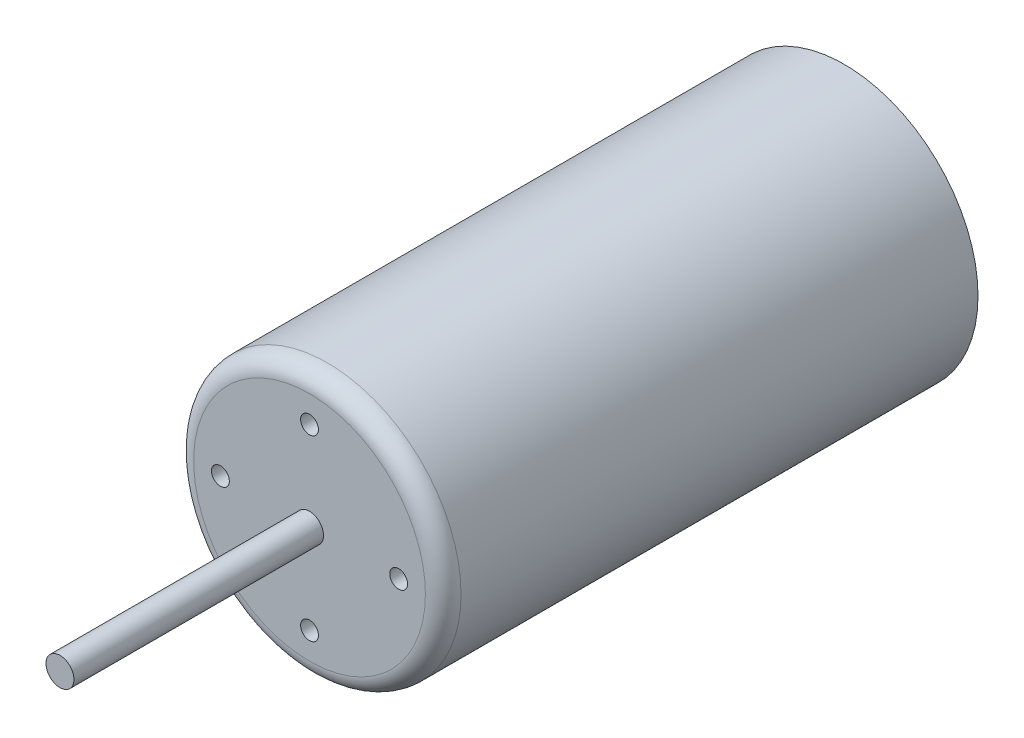
ISO-10303-21;
HEADER;
FILE_DESCRIPTION(('STEP AP214'),'2;1');
FILE_NAME('part.step','',(''),(''),'','','');
FILE_SCHEMA(('AUTOMOTIVE_DESIGN { 1 0 10303 214 1 1 1 1 }'));
ENDSEC;
DATA;
#1=APPLICATION_CONTEXT('core data for automotive mechanical design processes');
#2=APPLICATION_PROTOCOL_DEFINITION('international standard','automotive_design',2000,#1);
#3=PRODUCT_CONTEXT('',#1,'mechanical');
#4=PRODUCT('Part','Part','',(#3));
#5=PRODUCT_RELATED_PRODUCT_CATEGORY('part','',(#4));
#6=PRODUCT_DEFINITION_FORMATION('','',#4);
#7=PRODUCT_DEFINITION_CONTEXT('part definition',#1,'design');
#8=PRODUCT_DEFINITION('design','',#6,#7);
#9=PRODUCT_DEFINITION_SHAPE('','',#8);
#10=(LENGTH_UNIT() NAMED_UNIT(*) SI_UNIT(.MILLI.,.METRE.));
#11=(NAMED_UNIT(*) PLANE_ANGLE_UNIT() SI_UNIT($,.RADIAN.));
#12=(NAMED_UNIT(*) SI_UNIT($,.STERADIAN.) SOLID_ANGLE_UNIT());
#13=UNCERTAINTY_MEASURE_WITH_UNIT(LENGTH_MEASURE(1.E-05),#10,'distance_accuracy_value','');
#14=(GEOMETRIC_REPRESENTATION_CONTEXT(3) GLOBAL_UNCERTAINTY_ASSIGNED_CONTEXT((#13)) GLOBAL_UNIT_ASSIGNED_CONTEXT((#10,
#11,#12)) REPRESENTATION_CONTEXT('',''));
#15=CARTESIAN_POINT('',(0.,0.,0.));
#16=DIRECTION('',(0.,0.,1.));
#17=DIRECTION('',(1.,0.,0.));
#18=AXIS2_PLACEMENT_3D('',#15,#16,#17);
#19=CARTESIAN_POINT('',(0.,0.,76.2));
#20=DIRECTION('',(0.,0.,1.));
#21=DIRECTION('',(1.,0.,0.));
#22=AXIS2_PLACEMENT_3D('',#19,#20,#21);
#23=PLANE('',#22);
#24=CARTESIAN_POINT('',(0.,12.7,76.2));
#25=DIRECTION('',(0.,0.,1.));
#26=DIRECTION('',(1.,0.,0.));
#27=AXIS2_PLACEMENT_3D('',#24,#25,#26);
#28=CIRCLE('',#27,1.27);
#29=CARTESIAN_POINT('',(1.27,12.7,76.2));
#30=VERTEX_POINT('',#29);
#31=EDGE_CURVE('E73',#30,#30,#28,.T.);
#32=ORIENTED_EDGE('',*,*,#31,.F.);
#33=EDGE_LOOP('',(#32));
#34=FACE_BOUND('',#33,.T.);
#35=CARTESIAN_POINT('',(-12.7,0.,76.2));
#36=DIRECTION('',(0.,0.,1.));
#37=DIRECTION('',(1.,0.,0.));
#38=AXIS2_PLACEMENT_3D('',#35,#36,#37);
#39=CIRCLE('',#38,1.27);
#40=CARTESIAN_POINT('',(-11.43,0.,76.2));
#41=VERTEX_POINT('',#40);
#42=EDGE_CURVE('E67',#41,#41,#39,.T.);
#43=ORIENTED_EDGE('',*,*,#42,.F.);
#44=EDGE_LOOP('',(#43));
#45=FACE_BOUND('',#44,.T.);
#46=CARTESIAN_POINT('',(0.,-12.7,76.2));
#47=DIRECTION('',(0.,0.,1.));
#48=DIRECTION('',(1.,0.,0.));
#49=AXIS2_PLACEMENT_3D('',#46,#47,#48);
#50=CIRCLE('',#49,1.27);
#51=CARTESIAN_POINT('',(1.27,-12.7,76.2));
#52=VERTEX_POINT('',#51);
#53=EDGE_CURVE('E61',#52,#52,#50,.T.);
#54=ORIENTED_EDGE('',*,*,#53,.F.);
#55=EDGE_LOOP('',(#54));
#56=FACE_BOUND('',#55,.T.);
#57=CARTESIAN_POINT('',(12.7,0.,76.2));
#58=DIRECTION('',(0.,0.,1.));
#59=DIRECTION('',(1.,0.,0.));
#60=AXIS2_PLACEMENT_3D('',#57,#58,#59);
#61=CIRCLE('',#60,1.27);
#62=CARTESIAN_POINT('',(13.97,0.,76.2));
#63=VERTEX_POINT('',#62);
#64=EDGE_CURVE('E55',#63,#63,#61,.T.);
#65=ORIENTED_EDGE('',*,*,#64,.F.);
#66=EDGE_LOOP('',(#65));
#67=FACE_BOUND('',#66,.T.);
#68=CARTESIAN_POINT('',(0.,0.,76.2));
#69=DIRECTION('',(0.,0.,1.));
#70=DIRECTION('',(1.,0.,0.));
#71=AXIS2_PLACEMENT_3D('',#68,#69,#70);
#72=CIRCLE('',#71,16.51);
#73=CARTESIAN_POINT('',(16.51,0.,76.2));
#74=VERTEX_POINT('',#73);
#75=EDGE_CURVE('E38',#74,#74,#72,.T.);
#76=ORIENTED_EDGE('',*,*,#75,.T.);
#77=EDGE_LOOP('',(#76));
#78=FACE_BOUND('',#77,.T.);
#79=CARTESIAN_POINT('',(0.,0.,76.2));
#80=DIRECTION('',(0.,0.,1.));
#81=DIRECTION('',(1.,0.,0.));
#82=AXIS2_PLACEMENT_3D('',#79,#80,#81);
#83=CIRCLE('',#82,1.9939);
#84=CARTESIAN_POINT('',(1.9939,0.,76.2));
#85=VERTEX_POINT('',#84);
#86=EDGE_CURVE('E49',#85,#85,#83,.T.);
#87=ORIENTED_EDGE('',*,*,#86,.F.);
#88=EDGE_LOOP('',(#87));
#89=FACE_BOUND('',#88,.T.);
#90=ADVANCED_FACE('F31',(#34,#45,#56,#67,#78,#89),#23,.T.);
#91=CARTESIAN_POINT('',(0.,0.,76.2));
#92=DIRECTION('',(0.,0.,-1.));
#93=DIRECTION('',(-1.,0.,0.));
#94=AXIS2_PLACEMENT_3D('',#91,#92,#93);
#95=CYLINDRICAL_SURFACE('',#94,19.05);
#96=CARTESIAN_POINT('',(0.,0.,73.66));
#97=DIRECTION('',(0.,0.,1.));
#98=DIRECTION('',(1.,0.,0.));
#99=AXIS2_PLACEMENT_3D('',#96,#97,#98);
#100=CIRCLE('',#99,19.05);
#101=CARTESIAN_POINT('',(-19.05,0.,73.66));
#102=VERTEX_POINT('',#101);
#103=EDGE_CURVE('E10',#102,#102,#100,.F.);
#104=CARTESIAN_POINT('',(0.,0.,0.));
#105=DIRECTION('',(0.,0.,1.));
#106=DIRECTION('',(1.,0.,0.));
#107=AXIS2_PLACEMENT_3D('',#104,#105,#106);
#108=CIRCLE('',#107,19.05);
#109=CARTESIAN_POINT('',(-19.05,0.,0.));
#110=VERTEX_POINT('',#109);
#111=EDGE_CURVE('E42',#110,#110,#108,.T.);
#112=CARTESIAN_POINT('',(-19.05,0.,73.66));
#113=CARTESIAN_POINT('',(-19.05,0.,72.8927083333333));
#114=CARTESIAN_POINT('',(-19.05,0.,72.1254166666667));
#115=CARTESIAN_POINT('',(-19.05,0.,70.5908333333333));
#116=CARTESIAN_POINT('',(-19.05,0.,69.8235416666667));
#117=CARTESIAN_POINT('',(-19.05,0.,68.2889583333333));
#118=CARTESIAN_POINT('',(-19.05,0.,67.5216666666667));
#119=CARTESIAN_POINT('',(-19.05,0.,65.9870833333333));
#120=CARTESIAN_POINT('',(-19.05,0.,65.2197916666667));
#121=CARTESIAN_POINT('',(-19.05,0.,63.6852083333333));
#122=CARTESIAN_POINT('',(-19.05,0.,62.9179166666667));
#123=CARTESIAN_POINT('',(-19.05,0.,61.3833333333333));
#124=CARTESIAN_POINT('',(-19.05,0.,60.6160416666667));
#125=CARTESIAN_POINT('',(-19.05,0.,59.0814583333333));
#126=CARTESIAN_POINT('',(-19.05,0.,58.3141666666667));
#127=CARTESIAN_POINT('',(-19.05,0.,56.7795833333333));
#128=CARTESIAN_POINT('',(-19.05,0.,56.0122916666667));
#129=CARTESIAN_POINT('',(-19.05,0.,54.4777083333333));
#130=CARTESIAN_POINT('',(-19.05,0.,53.7104166666667));
#131=CARTESIAN_POINT('',(-19.05,0.,52.1758333333333));
#132=CARTESIAN_POINT('',(-19.05,0.,51.4085416666667));
#133=CARTESIAN_POINT('',(-19.05,0.,49.8739583333333));
#134=CARTESIAN_POINT('',(-19.05,0.,49.1066666666667));
#135=CARTESIAN_POINT('',(-19.05,0.,47.5720833333333));
#136=CARTESIAN_POINT('',(-19.05,0.,46.8047916666667));
#137=CARTESIAN_POINT('',(-19.05,0.,45.2702083333333));
#138=CARTESIAN_POINT('',(-19.05,0.,44.5029166666667));
#139=CARTESIAN_POINT('',(-19.05,0.,42.9683333333333));
#140=CARTESIAN_POINT('',(-19.05,0.,42.2010416666667));
#141=CARTESIAN_POINT('',(-19.05,0.,40.6664583333333));
#142=CARTESIAN_POINT('',(-19.05,0.,39.8991666666667));
#143=CARTESIAN_POINT('',(-19.05,0.,38.3645833333333));
#144=CARTESIAN_POINT('',(-19.05,0.,37.5972916666667));
#145=CARTESIAN_POINT('',(-19.05,0.,36.0627083333333));
#146=CARTESIAN_POINT('',(-19.05,0.,35.2954166666667));
#147=CARTESIAN_POINT('',(-19.05,0.,33.7608333333333));
#148=CARTESIAN_POINT('',(-19.05,0.,32.9935416666667));
#149=CARTESIAN_POINT('',(-19.05,0.,31.4589583333333));
#150=CARTESIAN_POINT('',(-19.05,0.,30.6916666666667));
#151=CARTESIAN_POINT('',(-19.05,0.,29.1570833333333));
#152=CARTESIAN_POINT('',(-19.05,0.,28.3897916666667));
#153=CARTESIAN_POINT('',(-19.05,0.,26.8552083333333));
#154=CARTESIAN_POINT('',(-19.05,0.,26.0879166666667));
#155=CARTESIAN_POINT('',(-19.05,0.,24.5533333333333));
#156=CARTESIAN_POINT('',(-19.05,0.,23.7860416666667));
#157=CARTESIAN_POINT('',(-19.05,0.,22.2514583333333));
#158=CARTESIAN_POINT('',(-19.05,0.,21.4841666666667));
#159=CARTESIAN_POINT('',(-19.05,0.,19.9495833333333));
#160=CARTESIAN_POINT('',(-19.05,0.,19.1822916666667));
#161=CARTESIAN_POINT('',(-19.05,0.,17.6477083333333));
#162=CARTESIAN_POINT('',(-19.05,0.,16.8804166666667));
#163=CARTESIAN_POINT('',(-19.05,0.,15.3458333333333));
#164=CARTESIAN_POINT('',(-19.05,0.,14.5785416666667));
#165=CARTESIAN_POINT('',(-19.05,0.,13.0439583333333));
#166=CARTESIAN_POINT('',(-19.05,0.,12.2766666666667));
#167=CARTESIAN_POINT('',(-19.05,0.,10.7420833333333));
#168=CARTESIAN_POINT('',(-19.05,0.,9.97479166666667));
#169=CARTESIAN_POINT('',(-19.05,0.,8.44020833333334));
#170=CARTESIAN_POINT('',(-19.05,0.,7.67291666666667));
#171=CARTESIAN_POINT('',(-19.05,0.,6.13833333333333));
#172=CARTESIAN_POINT('',(-19.05,0.,5.37104166666667));
#173=CARTESIAN_POINT('',(-19.05,0.,3.83645833333333));
#174=CARTESIAN_POINT('',(-19.05,0.,3.06916666666666));
#175=CARTESIAN_POINT('',(-19.05,0.,1.53458333333333));
#176=CARTESIAN_POINT('',(-19.05,0.,0.767291666666665));
#177=CARTESIAN_POINT('',(-19.05,0.,0.));
#178=B_SPLINE_CURVE_WITH_KNOTS('',3,(#112,#113,#114,#115,#116,#117,#118,#119,#120,#121,#122,
#123,#124,#125,#126,#127,#128,#129,#130,#131,#132,#133,#134,#135,#136,#137,#138,#139,#140,#141,
#142,#143,#144,#145,#146,#147,#148,#149,#150,#151,#152,#153,#154,#155,#156,#157,#158,#159,#160,
#161,#162,#163,#164,#165,#166,#167,#168,#169,#170,#171,#172,#173,#174,#175,#176,#177),
.UNSPECIFIED.,.F.,.F.,(4,2,2,2,2,2,2,2,2,2,2,2,2,2,2,2,2,2,2,2,2,2,2,2,2,2,2,2,2,2,2,2,4),(0.,
2.301875,4.60374999999999,6.905625,9.20749999999999,11.509375,13.81125,16.113125,18.415,
20.716875,23.01875,25.320625,27.6225,29.924375,32.22625,34.528125,36.83,39.131875,41.43375,
43.735625,46.0375,48.339375,50.64125,52.943125,55.245,57.546875,59.84875,62.150625,64.4525,
66.754375,69.05625,71.358125,73.66),.UNSPECIFIED.);
#179=EDGE_CURVE('BSEAM90',#102,#110,#178,.T.);
#180=ORIENTED_EDGE('',*,*,#103,.T.);
#181=ORIENTED_EDGE('',*,*,#111,.T.);
#182=ORIENTED_EDGE('',*,*,#179,.T.);
#183=ORIENTED_EDGE('',*,*,#179,.F.);
#184=EDGE_LOOP('',(#180,#182,#181,#183));
#185=FACE_BOUND('',#184,.T.);
#186=ADVANCED_FACE('F90',(#185),#95,.T.);
#187=CARTESIAN_POINT('',(0.,0.,0.));
#188=DIRECTION('',(0.,0.,1.));
#189=DIRECTION('',(1.,0.,0.));
#190=AXIS2_PLACEMENT_3D('',#187,#188,#189);
#191=PLANE('',#190);
#192=ORIENTED_EDGE('',*,*,#111,.F.);
#193=EDGE_LOOP('',(#192));
#194=FACE_BOUND('',#193,.T.);
#195=ADVANCED_FACE('F112',(#194),#191,.F.);
#196=CARTESIAN_POINT('',(0.,0.,73.66));
#197=DIRECTION('',(0.,0.,1.));
#198=DIRECTION('',(1.,0.,0.));
#199=AXIS2_PLACEMENT_3D('',#196,#197,#198);
#200=TOROIDAL_SURFACE('',#199,16.51,2.54);
#201=ORIENTED_EDGE('',*,*,#103,.F.);
#202=EDGE_LOOP('',(#201));
#203=FACE_BOUND('',#202,.T.);
#204=ORIENTED_EDGE('',*,*,#75,.F.);
#205=EDGE_LOOP('',(#204));
#206=FACE_BOUND('',#205,.T.);
#207=ADVANCED_FACE('F33',(#203,#206),#200,.T.);
#208=CARTESIAN_POINT('',(0.,0.,111.76));
#209=DIRECTION('',(0.,0.,-1.));
#210=DIRECTION('',(-1.,0.,0.));
#211=AXIS2_PLACEMENT_3D('',#208,#209,#210);
#212=CYLINDRICAL_SURFACE('',#211,1.9939);
#213=CARTESIAN_POINT('',(0.,0.,111.76));
#214=DIRECTION('',(0.,0.,1.));
#215=DIRECTION('',(1.,0.,0.));
#216=AXIS2_PLACEMENT_3D('',#213,#214,#215);
#217=CIRCLE('',#216,1.9939);
#218=CARTESIAN_POINT('',(1.9939,0.,111.76));
#219=VERTEX_POINT('',#218);
#220=EDGE_CURVE('E46',#219,#219,#217,.T.);
#221=ORIENTED_EDGE('',*,*,#220,.F.);
#222=EDGE_LOOP('',(#221));
#223=FACE_BOUND('',#222,.T.);
#224=ORIENTED_EDGE('',*,*,#86,.T.);
#225=EDGE_LOOP('',(#224));
#226=FACE_BOUND('',#225,.T.);
#227=ADVANCED_FACE('F100',(#223,#226),#212,.T.);
#228=CARTESIAN_POINT('',(0.,0.,111.76));
#229=DIRECTION('',(0.,0.,1.));
#230=DIRECTION('',(1.,0.,0.));
#231=AXIS2_PLACEMENT_3D('',#228,#229,#230);
#232=PLANE('',#231);
#233=ORIENTED_EDGE('',*,*,#220,.T.);
#234=EDGE_LOOP('',(#233));
#235=FACE_BOUND('',#234,.T.);
#236=ADVANCED_FACE('F102',(#235),#232,.T.);
#237=CARTESIAN_POINT('',(12.7,0.,40.64));
#238=DIRECTION('',(0.,0.,1.));
#239=DIRECTION('',(1.,0.,0.));
#240=AXIS2_PLACEMENT_3D('',#237,#238,#239);
#241=CYLINDRICAL_SURFACE('',#240,1.27);
#242=CARTESIAN_POINT('',(12.7,0.,40.64));
#243=DIRECTION('',(0.,0.,1.));
#244=DIRECTION('',(1.,0.,0.));
#245=AXIS2_PLACEMENT_3D('',#242,#243,#244);
#246=CIRCLE('',#245,1.27);
#247=CARTESIAN_POINT('',(13.97,0.,40.64));
#248=VERTEX_POINT('',#247);
#249=EDGE_CURVE('E52',#248,#248,#246,.T.);
#250=ORIENTED_EDGE('',*,*,#249,.F.);
#251=EDGE_LOOP('',(#250));
#252=FACE_BOUND('',#251,.T.);
#253=ORIENTED_EDGE('',*,*,#64,.T.);
#254=EDGE_LOOP('',(#253));
#255=FACE_BOUND('',#254,.T.);
#256=ADVANCED_FACE('F109',(#252,#255),#241,.F.);
#257=CARTESIAN_POINT('',(12.7,0.,40.64));
#258=DIRECTION('',(0.,0.,1.));
#259=DIRECTION('',(1.,0.,0.));
#260=AXIS2_PLACEMENT_3D('',#257,#258,#259);
#261=PLANE('',#260);
#262=ORIENTED_EDGE('',*,*,#249,.T.);
#263=EDGE_LOOP('',(#262));
#264=FACE_BOUND('',#263,.T.);
#265=ADVANCED_FACE('F157',(#264),#261,.T.);
#266=CARTESIAN_POINT('',(0.,-12.7,40.64));
#267=DIRECTION('',(0.,0.,1.));
#268=DIRECTION('',(1.,0.,0.));
#269=AXIS2_PLACEMENT_3D('',#266,#267,#268);
#270=CYLINDRICAL_SURFACE('',#269,1.27);
#271=CARTESIAN_POINT('',(0.,-12.7,40.64));
#272=DIRECTION('',(0.,0.,1.));
#273=DIRECTION('',(1.,0.,0.));
#274=AXIS2_PLACEMENT_3D('',#271,#272,#273);
#275=CIRCLE('',#274,1.27);
#276=CARTESIAN_POINT('',(1.27,-12.7,40.64));
#277=VERTEX_POINT('',#276);
#278=EDGE_CURVE('E58',#277,#277,#275,.T.);
#279=ORIENTED_EDGE('',*,*,#278,.F.);
#280=EDGE_LOOP('',(#279));
#281=FACE_BOUND('',#280,.T.);
#282=ORIENTED_EDGE('',*,*,#53,.T.);
#283=EDGE_LOOP('',(#282));
#284=FACE_BOUND('',#283,.T.);
#285=ADVANCED_FACE('F166',(#281,#284),#270,.F.);
#286=CARTESIAN_POINT('',(0.,-12.7,40.64));
#287=DIRECTION('',(0.,0.,1.));
#288=DIRECTION('',(1.,0.,0.));
#289=AXIS2_PLACEMENT_3D('',#286,#287,#288);
#290=PLANE('',#289);
#291=ORIENTED_EDGE('',*,*,#278,.T.);
#292=EDGE_LOOP('',(#291));
#293=FACE_BOUND('',#292,.T.);
#294=ADVANCED_FACE('F176',(#293),#290,.T.);
#295=CARTESIAN_POINT('',(-12.7,0.,40.64));
#296=DIRECTION('',(0.,0.,1.));
#297=DIRECTION('',(1.,0.,0.));
#298=AXIS2_PLACEMENT_3D('',#295,#296,#297);
#299=CYLINDRICAL_SURFACE('',#298,1.27);
#300=CARTESIAN_POINT('',(-12.7,0.,40.64));
#301=DIRECTION('',(0.,0.,1.));
#302=DIRECTION('',(1.,0.,0.));
#303=AXIS2_PLACEMENT_3D('',#300,#301,#302);
#304=CIRCLE('',#303,1.27);
#305=CARTESIAN_POINT('',(-11.43,0.,40.64));
#306=VERTEX_POINT('',#305);
#307=EDGE_CURVE('E64',#306,#306,#304,.T.);
#308=ORIENTED_EDGE('',*,*,#307,.F.);
#309=EDGE_LOOP('',(#308));
#310=FACE_BOUND('',#309,.T.);
#311=ORIENTED_EDGE('',*,*,#42,.T.);
#312=EDGE_LOOP('',(#311));
#313=FACE_BOUND('',#312,.T.);
#314=ADVANCED_FACE('F186',(#310,#313),#299,.F.);
#315=CARTESIAN_POINT('',(-12.7,0.,40.64));
#316=DIRECTION('',(0.,0.,1.));
#317=DIRECTION('',(1.,0.,0.));
#318=AXIS2_PLACEMENT_3D('',#315,#316,#317);
#319=PLANE('',#318);
#320=ORIENTED_EDGE('',*,*,#307,.T.);
#321=EDGE_LOOP('',(#320));
#322=FACE_BOUND('',#321,.T.);
#323=ADVANCED_FACE('F84',(#322),#319,.T.);
#324=CARTESIAN_POINT('',(0.,12.7,40.64));
#325=DIRECTION('',(0.,0.,1.));
#326=DIRECTION('',(1.,0.,0.));
#327=AXIS2_PLACEMENT_3D('',#324,#325,#326);
#328=CYLINDRICAL_SURFACE('',#327,1.27);
#329=CARTESIAN_POINT('',(0.,12.7,40.64));
#330=DIRECTION('',(0.,0.,1.));
#331=DIRECTION('',(1.,0.,0.));
#332=AXIS2_PLACEMENT_3D('',#329,#330,#331);
#333=CIRCLE('',#332,1.27);
#334=CARTESIAN_POINT('',(1.27,12.7,40.64));
#335=VERTEX_POINT('',#334);
#336=EDGE_CURVE('E70',#335,#335,#333,.T.);
#337=ORIENTED_EDGE('',*,*,#336,.F.);
#338=EDGE_LOOP('',(#337));
#339=FACE_BOUND('',#338,.T.);
#340=ORIENTED_EDGE('',*,*,#31,.T.);
#341=EDGE_LOOP('',(#340));
#342=FACE_BOUND('',#341,.T.);
#343=ADVANCED_FACE('F81',(#339,#342),#328,.F.);
#344=CARTESIAN_POINT('',(0.,12.7,40.64));
#345=DIRECTION('',(0.,0.,1.));
#346=DIRECTION('',(1.,0.,0.));
#347=AXIS2_PLACEMENT_3D('',#344,#345,#346);
#348=PLANE('',#347);
#349=ORIENTED_EDGE('',*,*,#336,.T.);
#350=EDGE_LOOP('',(#349));
#351=FACE_BOUND('',#350,.T.);
#352=ADVANCED_FACE('F79',(#351),#348,.T.);
#353=CLOSED_SHELL('',(#90,#186,#195,#207,#227,#236,#256,#265,#285,#294,#314,#323,#343,#352));
#354=MANIFOLD_SOLID_BREP('B2',#353);
#355=ADVANCED_BREP_SHAPE_REPRESENTATION('',(#18,#354),#14);
#356=SHAPE_DEFINITION_REPRESENTATION(#9,#355);
ENDSEC;
END-ISO-10303-21;
